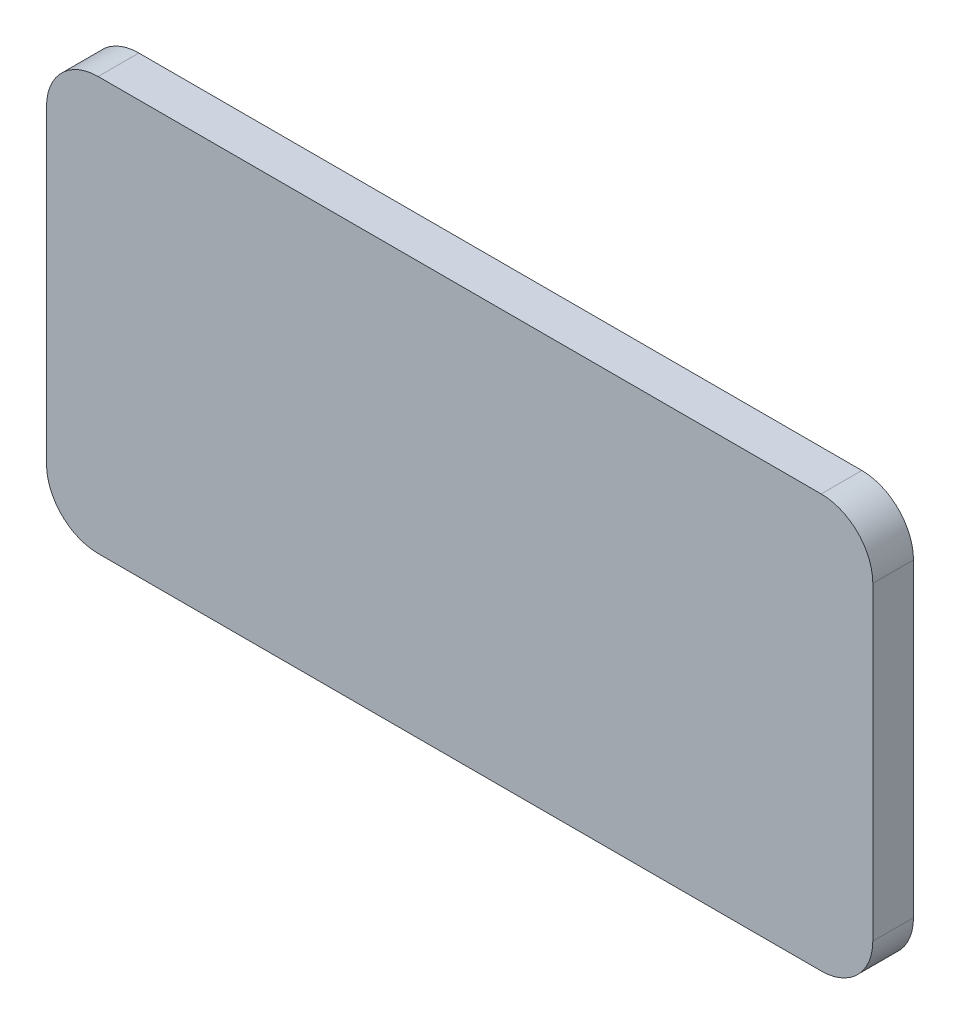
ISO-10303-21;
HEADER;
FILE_DESCRIPTION(('STEP AP214'),'2;1');
FILE_NAME('part.step','',(''),(''),'','','');
FILE_SCHEMA(('AUTOMOTIVE_DESIGN { 1 0 10303 214 1 1 1 1 }'));
ENDSEC;
DATA;
#1=APPLICATION_CONTEXT('core data for automotive mechanical design processes');
#2=APPLICATION_PROTOCOL_DEFINITION('international standard','automotive_design',2000,#1);
#3=PRODUCT_CONTEXT('',#1,'mechanical');
#4=PRODUCT('Part','Part','',(#3));
#5=PRODUCT_RELATED_PRODUCT_CATEGORY('part','',(#4));
#6=PRODUCT_DEFINITION_FORMATION('','',#4);
#7=PRODUCT_DEFINITION_CONTEXT('part definition',#1,'design');
#8=PRODUCT_DEFINITION('design','',#6,#7);
#9=PRODUCT_DEFINITION_SHAPE('','',#8);
#10=(LENGTH_UNIT() NAMED_UNIT(*) SI_UNIT(.MILLI.,.METRE.));
#11=(NAMED_UNIT(*) PLANE_ANGLE_UNIT() SI_UNIT($,.RADIAN.));
#12=(NAMED_UNIT(*) SI_UNIT($,.STERADIAN.) SOLID_ANGLE_UNIT());
#13=UNCERTAINTY_MEASURE_WITH_UNIT(LENGTH_MEASURE(1.E-05),#10,'distance_accuracy_value','');
#14=(GEOMETRIC_REPRESENTATION_CONTEXT(3) GLOBAL_UNCERTAINTY_ASSIGNED_CONTEXT((#13)) GLOBAL_UNIT_ASSIGNED_CONTEXT((#10,
#11,#12)) REPRESENTATION_CONTEXT('',''));
#15=CARTESIAN_POINT('',(0.,0.,0.));
#16=DIRECTION('',(0.,0.,1.));
#17=DIRECTION('',(1.,0.,0.));
#18=AXIS2_PLACEMENT_3D('',#15,#16,#17);
#19=CARTESIAN_POINT('',(20.32,-10.16,2.));
#20=DIRECTION('',(-1.,0.,0.));
#21=DIRECTION('',(0.,0.,1.));
#22=AXIS2_PLACEMENT_3D('',#19,#20,#21);
#23=PLANE('',#22);
#24=DIRECTION('',(0.,1.,0.));
#25=VECTOR('',#24,1.);
#26=CARTESIAN_POINT('',(20.32,-10.16,0.));
#27=LINE('',#26,#25);
#28=CARTESIAN_POINT('',(20.32,-7.62,0.));
#29=VERTEX_POINT('',#28);
#30=CARTESIAN_POINT('',(20.32,7.62,0.));
#31=VERTEX_POINT('',#30);
#32=EDGE_CURVE('E157',#29,#31,#27,.T.);
#33=ORIENTED_EDGE('',*,*,#32,.T.);
#34=DIRECTION('',(0.,0.,-1.));
#35=VECTOR('',#34,1.);
#36=CARTESIAN_POINT('',(20.32,7.62,2.));
#37=LINE('',#36,#35);
#38=CARTESIAN_POINT('',(20.32,7.62,2.));
#39=VERTEX_POINT('',#38);
#40=EDGE_CURVE('E197',#31,#39,#37,.F.);
#41=ORIENTED_EDGE('',*,*,#40,.T.);
#42=DIRECTION('',(0.,1.,0.));
#43=VECTOR('',#42,1.);
#44=CARTESIAN_POINT('',(20.32,-10.16,2.));
#45=LINE('',#44,#43);
#46=CARTESIAN_POINT('',(20.32,-7.62,2.));
#47=VERTEX_POINT('',#46);
#48=EDGE_CURVE('E158',#47,#39,#45,.T.);
#49=ORIENTED_EDGE('',*,*,#48,.F.);
#50=DIRECTION('',(0.,0.,-1.));
#51=VECTOR('',#50,1.);
#52=CARTESIAN_POINT('',(20.32,-7.62,2.));
#53=LINE('',#52,#51);
#54=EDGE_CURVE('E194',#47,#29,#53,.T.);
#55=ORIENTED_EDGE('',*,*,#54,.T.);
#56=EDGE_LOOP('',(#33,#41,#49,#55));
#57=FACE_BOUND('',#56,.T.);
#58=ADVANCED_FACE('F35',(#57),#23,.F.);
#59=CARTESIAN_POINT('',(-20.32,10.16,2.));
#60=DIRECTION('',(0.,-1.,0.));
#61=DIRECTION('',(0.,0.,-1.));
#62=AXIS2_PLACEMENT_3D('',#59,#60,#61);
#63=PLANE('',#62);
#64=DIRECTION('',(-1.,0.,0.));
#65=VECTOR('',#64,1.);
#66=CARTESIAN_POINT('',(-20.32,10.16,2.));
#67=LINE('',#66,#65);
#68=CARTESIAN_POINT('',(17.78,10.16,2.));
#69=VERTEX_POINT('',#68);
#70=CARTESIAN_POINT('',(-17.78,10.16,2.));
#71=VERTEX_POINT('',#70);
#72=EDGE_CURVE('E161',#69,#71,#67,.T.);
#73=ORIENTED_EDGE('',*,*,#72,.F.);
#74=DIRECTION('',(0.,0.,-1.));
#75=VECTOR('',#74,1.);
#76=CARTESIAN_POINT('',(17.78,10.16,2.));
#77=LINE('',#76,#75);
#78=CARTESIAN_POINT('',(17.78,10.16,0.));
#79=VERTEX_POINT('',#78);
#80=EDGE_CURVE('E183',#69,#79,#77,.T.);
#81=ORIENTED_EDGE('',*,*,#80,.T.);
#82=DIRECTION('',(-1.,0.,0.));
#83=VECTOR('',#82,1.);
#84=CARTESIAN_POINT('',(-20.32,10.16,0.));
#85=LINE('',#84,#83);
#86=CARTESIAN_POINT('',(-17.78,10.16,0.));
#87=VERTEX_POINT('',#86);
#88=EDGE_CURVE('E174',#79,#87,#85,.T.);
#89=ORIENTED_EDGE('',*,*,#88,.T.);
#90=DIRECTION('',(0.,0.,-1.));
#91=VECTOR('',#90,1.);
#92=CARTESIAN_POINT('',(-17.78,10.16,2.));
#93=LINE('',#92,#91);
#94=EDGE_CURVE('E171',#87,#71,#93,.F.);
#95=ORIENTED_EDGE('',*,*,#94,.T.);
#96=EDGE_LOOP('',(#73,#81,#89,#95));
#97=FACE_BOUND('',#96,.T.);
#98=ADVANCED_FACE('F245',(#97),#63,.F.);
#99=CARTESIAN_POINT('',(-20.32,-10.16,2.));
#100=DIRECTION('',(1.,0.,0.));
#101=DIRECTION('',(0.,0.,-1.));
#102=AXIS2_PLACEMENT_3D('',#99,#100,#101);
#103=PLANE('',#102);
#104=DIRECTION('',(0.,-1.,0.));
#105=VECTOR('',#104,1.);
#106=CARTESIAN_POINT('',(-20.32,-10.16,2.));
#107=LINE('',#106,#105);
#108=CARTESIAN_POINT('',(-20.32,7.62,2.));
#109=VERTEX_POINT('',#108);
#110=CARTESIAN_POINT('',(-20.32,-7.62,2.));
#111=VERTEX_POINT('',#110);
#112=EDGE_CURVE('E165',#109,#111,#107,.T.);
#113=ORIENTED_EDGE('',*,*,#112,.F.);
#114=DIRECTION('',(0.,0.,-1.));
#115=VECTOR('',#114,1.);
#116=CARTESIAN_POINT('',(-20.32,7.62,2.));
#117=LINE('',#116,#115);
#118=CARTESIAN_POINT('',(-20.32,7.62,0.));
#119=VERTEX_POINT('',#118);
#120=EDGE_CURVE('E12',#109,#119,#117,.T.);
#121=ORIENTED_EDGE('',*,*,#120,.T.);
#122=DIRECTION('',(0.,-1.,0.));
#123=VECTOR('',#122,1.);
#124=CARTESIAN_POINT('',(-20.32,-10.16,0.));
#125=LINE('',#124,#123);
#126=CARTESIAN_POINT('',(-20.32,-7.62,0.));
#127=VERTEX_POINT('',#126);
#128=EDGE_CURVE('E177',#119,#127,#125,.T.);
#129=ORIENTED_EDGE('',*,*,#128,.T.);
#130=DIRECTION('',(0.,0.,-1.));
#131=VECTOR('',#130,1.);
#132=CARTESIAN_POINT('',(-20.32,-7.62,2.));
#133=LINE('',#132,#131);
#134=EDGE_CURVE('E43',#127,#111,#133,.F.);
#135=ORIENTED_EDGE('',*,*,#134,.T.);
#136=EDGE_LOOP('',(#113,#121,#129,#135));
#137=FACE_BOUND('',#136,.T.);
#138=ADVANCED_FACE('F214',(#137),#103,.F.);
#139=CARTESIAN_POINT('',(-20.32,-10.16,2.));
#140=DIRECTION('',(0.,1.,0.));
#141=DIRECTION('',(0.,0.,1.));
#142=AXIS2_PLACEMENT_3D('',#139,#140,#141);
#143=PLANE('',#142);
#144=DIRECTION('',(1.,0.,0.));
#145=VECTOR('',#144,1.);
#146=CARTESIAN_POINT('',(-20.32,-10.16,0.));
#147=LINE('',#146,#145);
#148=CARTESIAN_POINT('',(-17.78,-10.16,0.));
#149=VERTEX_POINT('',#148);
#150=CARTESIAN_POINT('',(17.78,-10.16,0.));
#151=VERTEX_POINT('',#150);
#152=EDGE_CURVE('E162',#149,#151,#147,.T.);
#153=ORIENTED_EDGE('',*,*,#152,.T.);
#154=DIRECTION('',(0.,0.,-1.));
#155=VECTOR('',#154,1.);
#156=CARTESIAN_POINT('',(17.78,-10.16,2.));
#157=LINE('',#156,#155);
#158=CARTESIAN_POINT('',(17.78,-10.16,2.));
#159=VERTEX_POINT('',#158);
#160=EDGE_CURVE('E210',#151,#159,#157,.F.);
#161=ORIENTED_EDGE('',*,*,#160,.T.);
#162=DIRECTION('',(1.,0.,0.));
#163=VECTOR('',#162,1.);
#164=CARTESIAN_POINT('',(-20.32,-10.16,2.));
#165=LINE('',#164,#163);
#166=CARTESIAN_POINT('',(-17.78,-10.16,2.));
#167=VERTEX_POINT('',#166);
#168=EDGE_CURVE('E168',#167,#159,#165,.T.);
#169=ORIENTED_EDGE('',*,*,#168,.F.);
#170=DIRECTION('',(0.,0.,-1.));
#171=VECTOR('',#170,1.);
#172=CARTESIAN_POINT('',(-17.78,-10.16,2.));
#173=LINE('',#172,#171);
#174=EDGE_CURVE('E207',#167,#149,#173,.T.);
#175=ORIENTED_EDGE('',*,*,#174,.T.);
#176=EDGE_LOOP('',(#153,#161,#169,#175));
#177=FACE_BOUND('',#176,.T.);
#178=ADVANCED_FACE('F226',(#177),#143,.F.);
#179=CARTESIAN_POINT('',(0.,0.,2.));
#180=DIRECTION('',(0.,0.,-1.));
#181=DIRECTION('',(-1.,0.,0.));
#182=AXIS2_PLACEMENT_3D('',#179,#180,#181);
#183=PLANE('',#182);
#184=ORIENTED_EDGE('',*,*,#48,.T.);
#185=CARTESIAN_POINT('',(17.78,7.62,2.));
#186=DIRECTION('',(0.,0.,-1.));
#187=DIRECTION('',(-1.,0.,0.));
#188=AXIS2_PLACEMENT_3D('',#185,#186,#187);
#189=CIRCLE('',#188,2.54);
#190=EDGE_CURVE('E205',#39,#69,#189,.F.);
#191=ORIENTED_EDGE('',*,*,#190,.T.);
#192=ORIENTED_EDGE('',*,*,#72,.T.);
#193=CARTESIAN_POINT('',(-17.78,7.62,2.));
#194=DIRECTION('',(0.,0.,-1.));
#195=DIRECTION('',(-1.,0.,0.));
#196=AXIS2_PLACEMENT_3D('',#193,#194,#195);
#197=CIRCLE('',#196,2.54);
#198=EDGE_CURVE('E201',#71,#109,#197,.F.);
#199=ORIENTED_EDGE('',*,*,#198,.T.);
#200=ORIENTED_EDGE('',*,*,#112,.T.);
#201=CARTESIAN_POINT('',(-17.78,-7.62,2.));
#202=DIRECTION('',(0.,0.,-1.));
#203=DIRECTION('',(-1.,0.,0.));
#204=AXIS2_PLACEMENT_3D('',#201,#202,#203);
#205=CIRCLE('',#204,2.54);
#206=EDGE_CURVE('E199',#111,#167,#205,.F.);
#207=ORIENTED_EDGE('',*,*,#206,.T.);
#208=ORIENTED_EDGE('',*,*,#168,.T.);
#209=CARTESIAN_POINT('',(17.78,-7.62,2.));
#210=DIRECTION('',(0.,0.,-1.));
#211=DIRECTION('',(-1.,0.,0.));
#212=AXIS2_PLACEMENT_3D('',#209,#210,#211);
#213=CIRCLE('',#212,2.54);
#214=EDGE_CURVE('E203',#159,#47,#213,.F.);
#215=ORIENTED_EDGE('',*,*,#214,.T.);
#216=EDGE_LOOP('',(#184,#191,#192,#199,#200,#207,#208,#215));
#217=FACE_BOUND('',#216,.T.);
#218=ADVANCED_FACE('F220',(#217),#183,.F.);
#219=CARTESIAN_POINT('',(0.,0.,0.));
#220=DIRECTION('',(0.,0.,-1.));
#221=DIRECTION('',(-1.,0.,0.));
#222=AXIS2_PLACEMENT_3D('',#219,#220,#221);
#223=PLANE('',#222);
#224=DIRECTION('',(-1.,0.,0.));
#225=VECTOR('',#224,1.);
#226=CARTESIAN_POINT('',(14.097,7.1247,0.));
#227=LINE('',#226,#225);
#228=CARTESIAN_POINT('',(14.097,7.1247,0.));
#229=VERTEX_POINT('',#228);
#230=CARTESIAN_POINT('',(-7.8232,7.1247,0.));
#231=VERTEX_POINT('',#230);
#232=EDGE_CURVE('E50',#229,#231,#227,.T.);
#233=ORIENTED_EDGE('',*,*,#232,.T.);
#234=DIRECTION('',(0.,-1.,0.));
#235=VECTOR('',#234,1.);
#236=CARTESIAN_POINT('',(-7.8232,-7.1247,0.));
#237=LINE('',#236,#235);
#238=CARTESIAN_POINT('',(-7.8232,-7.1247,0.));
#239=VERTEX_POINT('',#238);
#240=EDGE_CURVE('E55',#231,#239,#237,.T.);
#241=ORIENTED_EDGE('',*,*,#240,.T.);
#242=DIRECTION('',(1.,0.,0.));
#243=VECTOR('',#242,1.);
#244=CARTESIAN_POINT('',(14.097,-7.1247,0.));
#245=LINE('',#244,#243);
#246=CARTESIAN_POINT('',(14.097,-7.1247,0.));
#247=VERTEX_POINT('',#246);
#248=EDGE_CURVE('E142',#239,#247,#245,.T.);
#249=ORIENTED_EDGE('',*,*,#248,.T.);
#250=DIRECTION('',(0.,1.,0.));
#251=VECTOR('',#250,1.);
#252=CARTESIAN_POINT('',(14.097,-7.1247,0.));
#253=LINE('',#252,#251);
#254=EDGE_CURVE('E147',#247,#229,#253,.T.);
#255=ORIENTED_EDGE('',*,*,#254,.T.);
#256=EDGE_LOOP('',(#233,#241,#249,#255));
#257=FACE_BOUND('',#256,.T.);
#258=ORIENTED_EDGE('',*,*,#88,.F.);
#259=CARTESIAN_POINT('',(17.78,7.62,0.));
#260=DIRECTION('',(0.,0.,-1.));
#261=DIRECTION('',(-1.,0.,0.));
#262=AXIS2_PLACEMENT_3D('',#259,#260,#261);
#263=CIRCLE('',#262,2.54);
#264=EDGE_CURVE('E192',#79,#31,#263,.T.);
#265=ORIENTED_EDGE('',*,*,#264,.T.);
#266=ORIENTED_EDGE('',*,*,#32,.F.);
#267=CARTESIAN_POINT('',(17.78,-7.62,0.));
#268=DIRECTION('',(0.,0.,-1.));
#269=DIRECTION('',(-1.,0.,0.));
#270=AXIS2_PLACEMENT_3D('',#267,#268,#269);
#271=CIRCLE('',#270,2.54);
#272=EDGE_CURVE('E190',#29,#151,#271,.T.);
#273=ORIENTED_EDGE('',*,*,#272,.T.);
#274=ORIENTED_EDGE('',*,*,#152,.F.);
#275=CARTESIAN_POINT('',(-17.78,-7.62,0.));
#276=DIRECTION('',(0.,0.,-1.));
#277=DIRECTION('',(-1.,0.,0.));
#278=AXIS2_PLACEMENT_3D('',#275,#276,#277);
#279=CIRCLE('',#278,2.54);
#280=EDGE_CURVE('E186',#149,#127,#279,.T.);
#281=ORIENTED_EDGE('',*,*,#280,.T.);
#282=ORIENTED_EDGE('',*,*,#128,.F.);
#283=CARTESIAN_POINT('',(-17.78,7.62,0.));
#284=DIRECTION('',(0.,0.,-1.));
#285=DIRECTION('',(-1.,0.,0.));
#286=AXIS2_PLACEMENT_3D('',#283,#284,#285);
#287=CIRCLE('',#286,2.54);
#288=EDGE_CURVE('E188',#119,#87,#287,.T.);
#289=ORIENTED_EDGE('',*,*,#288,.T.);
#290=EDGE_LOOP('',(#258,#265,#266,#273,#274,#281,#282,#289));
#291=FACE_BOUND('',#290,.T.);
#292=ADVANCED_FACE('F230',(#257,#291),#223,.T.);
#293=CARTESIAN_POINT('',(17.78,7.62,2.));
#294=DIRECTION('',(0.,0.,-1.));
#295=DIRECTION('',(-1.,0.,0.));
#296=AXIS2_PLACEMENT_3D('',#293,#294,#295);
#297=CYLINDRICAL_SURFACE('',#296,2.54);
#298=ORIENTED_EDGE('',*,*,#190,.F.);
#299=ORIENTED_EDGE('',*,*,#40,.F.);
#300=ORIENTED_EDGE('',*,*,#264,.F.);
#301=ORIENTED_EDGE('',*,*,#80,.F.);
#302=EDGE_LOOP('',(#298,#299,#300,#301));
#303=FACE_BOUND('',#302,.T.);
#304=ADVANCED_FACE('F243',(#303),#297,.T.);
#305=CARTESIAN_POINT('',(17.78,-7.62,2.));
#306=DIRECTION('',(0.,0.,-1.));
#307=DIRECTION('',(-1.,0.,0.));
#308=AXIS2_PLACEMENT_3D('',#305,#306,#307);
#309=CYLINDRICAL_SURFACE('',#308,2.54);
#310=ORIENTED_EDGE('',*,*,#214,.F.);
#311=ORIENTED_EDGE('',*,*,#160,.F.);
#312=ORIENTED_EDGE('',*,*,#272,.F.);
#313=ORIENTED_EDGE('',*,*,#54,.F.);
#314=EDGE_LOOP('',(#310,#311,#312,#313));
#315=FACE_BOUND('',#314,.T.);
#316=ADVANCED_FACE('F235',(#315),#309,.T.);
#317=CARTESIAN_POINT('',(-17.78,7.62,2.));
#318=DIRECTION('',(0.,0.,-1.));
#319=DIRECTION('',(-1.,0.,0.));
#320=AXIS2_PLACEMENT_3D('',#317,#318,#319);
#321=CYLINDRICAL_SURFACE('',#320,2.54);
#322=ORIENTED_EDGE('',*,*,#198,.F.);
#323=ORIENTED_EDGE('',*,*,#94,.F.);
#324=ORIENTED_EDGE('',*,*,#288,.F.);
#325=ORIENTED_EDGE('',*,*,#120,.F.);
#326=EDGE_LOOP('',(#322,#323,#324,#325));
#327=FACE_BOUND('',#326,.T.);
#328=ADVANCED_FACE('F248',(#327),#321,.T.);
#329=CARTESIAN_POINT('',(-17.78,-7.62,2.));
#330=DIRECTION('',(0.,0.,-1.));
#331=DIRECTION('',(-1.,0.,0.));
#332=AXIS2_PLACEMENT_3D('',#329,#330,#331);
#333=CYLINDRICAL_SURFACE('',#332,2.54);
#334=ORIENTED_EDGE('',*,*,#206,.F.);
#335=ORIENTED_EDGE('',*,*,#134,.F.);
#336=ORIENTED_EDGE('',*,*,#280,.F.);
#337=ORIENTED_EDGE('',*,*,#174,.F.);
#338=EDGE_LOOP('',(#334,#335,#336,#337));
#339=FACE_BOUND('',#338,.T.);
#340=ADVANCED_FACE('F37',(#339),#333,.T.);
#341=CARTESIAN_POINT('',(0.,0.,-2.064));
#342=DIRECTION('',(0.,0.,-1.));
#343=DIRECTION('',(-1.,0.,0.));
#344=AXIS2_PLACEMENT_3D('',#341,#342,#343);
#345=PLANE('',#344);
#346=DIRECTION('',(0.,1.,0.));
#347=VECTOR('',#346,1.);
#348=CARTESIAN_POINT('',(14.097,-7.1247,-2.064));
#349=LINE('',#348,#347);
#350=CARTESIAN_POINT('',(14.097,-7.1247,-2.064));
#351=VERTEX_POINT('',#350);
#352=CARTESIAN_POINT('',(14.097,7.1247,-2.064));
#353=VERTEX_POINT('',#352);
#354=EDGE_CURVE('E149',#351,#353,#349,.T.);
#355=ORIENTED_EDGE('',*,*,#354,.F.);
#356=DIRECTION('',(1.,0.,0.));
#357=VECTOR('',#356,1.);
#358=CARTESIAN_POINT('',(14.097,-7.1247,-2.064));
#359=LINE('',#358,#357);
#360=CARTESIAN_POINT('',(-7.8232,-7.1247,-2.064));
#361=VERTEX_POINT('',#360);
#362=EDGE_CURVE('E129',#361,#351,#359,.T.);
#363=ORIENTED_EDGE('',*,*,#362,.F.);
#364=DIRECTION('',(0.,-1.,0.));
#365=VECTOR('',#364,1.);
#366=CARTESIAN_POINT('',(-7.8232,-7.1247,-2.064));
#367=LINE('',#366,#365);
#368=CARTESIAN_POINT('',(-7.8232,7.1247,-2.064));
#369=VERTEX_POINT('',#368);
#370=EDGE_CURVE('E122',#369,#361,#367,.T.);
#371=ORIENTED_EDGE('',*,*,#370,.F.);
#372=DIRECTION('',(-1.,0.,0.));
#373=VECTOR('',#372,1.);
#374=CARTESIAN_POINT('',(14.097,7.1247,-2.064));
#375=LINE('',#374,#373);
#376=EDGE_CURVE('E126',#353,#369,#375,.T.);
#377=ORIENTED_EDGE('',*,*,#376,.F.);
#378=EDGE_LOOP('',(#355,#363,#371,#377));
#379=FACE_BOUND('',#378,.T.);
#380=ADVANCED_FACE('F124',(#379),#345,.T.);
#381=CARTESIAN_POINT('',(14.097,7.1247,-32.2726087826917));
#382=DIRECTION('',(0.,1.,0.));
#383=DIRECTION('',(-1.,0.,0.));
#384=AXIS2_PLACEMENT_3D('',#381,#382,#383);
#385=PLANE('',#384);
#386=DIRECTION('',(0.,0.,1.));
#387=VECTOR('',#386,1.);
#388=CARTESIAN_POINT('',(14.097,7.1247,-32.2726087826917));
#389=LINE('',#388,#387);
#390=EDGE_CURVE('E141',#353,#229,#389,.T.);
#391=ORIENTED_EDGE('',*,*,#390,.F.);
#392=ORIENTED_EDGE('',*,*,#376,.T.);
#393=DIRECTION('',(0.,0.,1.));
#394=VECTOR('',#393,1.);
#395=CARTESIAN_POINT('',(-7.8232,7.1247,-32.2726087826917));
#396=LINE('',#395,#394);
#397=EDGE_CURVE('E133',#369,#231,#396,.T.);
#398=ORIENTED_EDGE('',*,*,#397,.T.);
#399=ORIENTED_EDGE('',*,*,#232,.F.);
#400=EDGE_LOOP('',(#391,#392,#398,#399));
#401=FACE_BOUND('',#400,.T.);
#402=ADVANCED_FACE('F139',(#401),#385,.T.);
#403=CARTESIAN_POINT('',(-7.8232,-7.1247,-32.2726087826917));
#404=DIRECTION('',(-1.,0.,0.));
#405=DIRECTION('',(0.,-1.,0.));
#406=AXIS2_PLACEMENT_3D('',#403,#404,#405);
#407=PLANE('',#406);
#408=ORIENTED_EDGE('',*,*,#397,.F.);
#409=ORIENTED_EDGE('',*,*,#370,.T.);
#410=DIRECTION('',(0.,0.,1.));
#411=VECTOR('',#410,1.);
#412=CARTESIAN_POINT('',(-7.8232,-7.1247,-32.2726087826917));
#413=LINE('',#412,#411);
#414=EDGE_CURVE('E132',#361,#239,#413,.T.);
#415=ORIENTED_EDGE('',*,*,#414,.T.);
#416=ORIENTED_EDGE('',*,*,#240,.F.);
#417=EDGE_LOOP('',(#408,#409,#415,#416));
#418=FACE_BOUND('',#417,.T.);
#419=ADVANCED_FACE('F135',(#418),#407,.T.);
#420=CARTESIAN_POINT('',(14.097,-7.1247,-32.2726087826917));
#421=DIRECTION('',(0.,-1.,0.));
#422=DIRECTION('',(1.,0.,0.));
#423=AXIS2_PLACEMENT_3D('',#420,#421,#422);
#424=PLANE('',#423);
#425=ORIENTED_EDGE('',*,*,#414,.F.);
#426=ORIENTED_EDGE('',*,*,#362,.T.);
#427=DIRECTION('',(0.,0.,1.));
#428=VECTOR('',#427,1.);
#429=CARTESIAN_POINT('',(14.097,-7.1247,-32.2726087826917));
#430=LINE('',#429,#428);
#431=EDGE_CURVE('E151',#351,#247,#430,.T.);
#432=ORIENTED_EDGE('',*,*,#431,.T.);
#433=ORIENTED_EDGE('',*,*,#248,.F.);
#434=EDGE_LOOP('',(#425,#426,#432,#433));
#435=FACE_BOUND('',#434,.T.);
#436=ADVANCED_FACE('F336',(#435),#424,.T.);
#437=CARTESIAN_POINT('',(14.097,-7.1247,-32.2726087826917));
#438=DIRECTION('',(1.,0.,0.));
#439=DIRECTION('',(0.,1.,0.));
#440=AXIS2_PLACEMENT_3D('',#437,#438,#439);
#441=PLANE('',#440);
#442=ORIENTED_EDGE('',*,*,#431,.F.);
#443=ORIENTED_EDGE('',*,*,#354,.T.);
#444=ORIENTED_EDGE('',*,*,#390,.T.);
#445=ORIENTED_EDGE('',*,*,#254,.F.);
#446=EDGE_LOOP('',(#442,#443,#444,#445));
#447=FACE_BOUND('',#446,.T.);
#448=ADVANCED_FACE('F345',(#447),#441,.T.);
#449=CLOSED_SHELL('',(#58,#98,#138,#178,#218,#292,#304,#316,#328,#340,#380,#402,#419,#436,#448));
#450=MANIFOLD_SOLID_BREP('B2',#449);
#451=ADVANCED_BREP_SHAPE_REPRESENTATION('',(#18,#450),#14);
#452=SHAPE_DEFINITION_REPRESENTATION(#9,#451);
ENDSEC;
END-ISO-10303-21;
